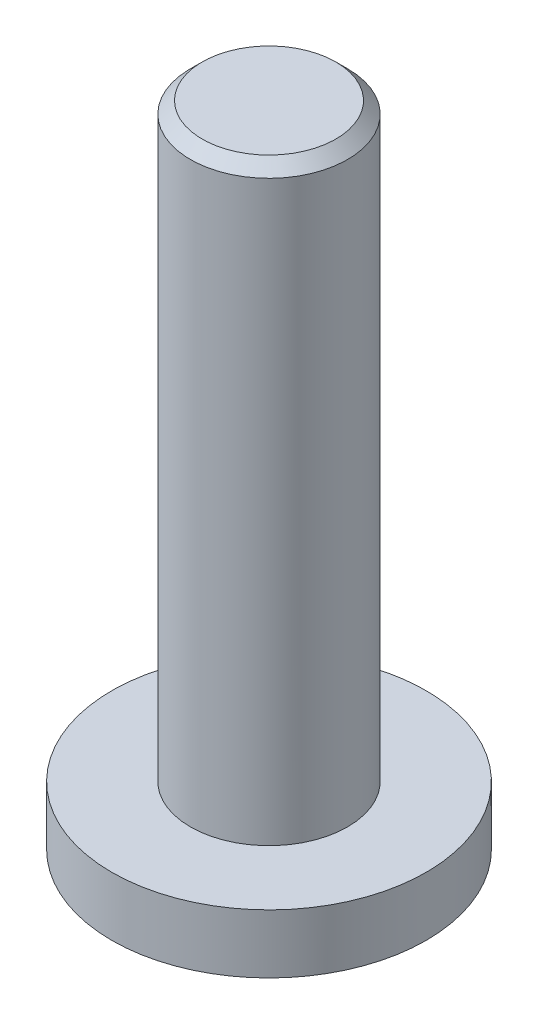
ISO-10303-21;
HEADER;
FILE_DESCRIPTION(('STEP AP214'),'2;1');
FILE_NAME('part.step','',(''),(''),'','','');
FILE_SCHEMA(('AUTOMOTIVE_DESIGN { 1 0 10303 214 1 1 1 1 }'));
ENDSEC;
DATA;
#1=APPLICATION_CONTEXT('core data for automotive mechanical design processes');
#2=APPLICATION_PROTOCOL_DEFINITION('international standard','automotive_design',2000,#1);
#3=PRODUCT_CONTEXT('',#1,'mechanical');
#4=PRODUCT('Part','Part','',(#3));
#5=PRODUCT_RELATED_PRODUCT_CATEGORY('part','',(#4));
#6=PRODUCT_DEFINITION_FORMATION('','',#4);
#7=PRODUCT_DEFINITION_CONTEXT('part definition',#1,'design');
#8=PRODUCT_DEFINITION('design','',#6,#7);
#9=PRODUCT_DEFINITION_SHAPE('','',#8);
#10=(LENGTH_UNIT() NAMED_UNIT(*) SI_UNIT(.MILLI.,.METRE.));
#11=(NAMED_UNIT(*) PLANE_ANGLE_UNIT() SI_UNIT($,.RADIAN.));
#12=(NAMED_UNIT(*) SI_UNIT($,.STERADIAN.) SOLID_ANGLE_UNIT());
#13=UNCERTAINTY_MEASURE_WITH_UNIT(LENGTH_MEASURE(1.E-05),#10,'distance_accuracy_value','');
#14=(GEOMETRIC_REPRESENTATION_CONTEXT(3) GLOBAL_UNCERTAINTY_ASSIGNED_CONTEXT((#13)) GLOBAL_UNIT_ASSIGNED_CONTEXT((#10,
#11,#12)) REPRESENTATION_CONTEXT('',''));
#15=CARTESIAN_POINT('',(0.,0.,0.));
#16=DIRECTION('',(0.,0.,1.));
#17=DIRECTION('',(1.,0.,0.));
#18=AXIS2_PLACEMENT_3D('',#15,#16,#17);
#19=CARTESIAN_POINT('',(0.,3.,0.));
#20=DIRECTION('',(0.,-1.,0.));
#21=DIRECTION('',(0.,0.,-1.));
#22=AXIS2_PLACEMENT_3D('',#19,#20,#21);
#23=CYLINDRICAL_SURFACE('',#22,8.);
#24=CARTESIAN_POINT('',(0.,3.,0.));
#25=DIRECTION('',(0.,1.,0.));
#26=DIRECTION('',(0.,0.,1.));
#27=AXIS2_PLACEMENT_3D('',#24,#25,#26);
#28=CIRCLE('',#27,8.);
#29=CARTESIAN_POINT('',(0.,3.,8.));
#30=VERTEX_POINT('',#29);
#31=EDGE_CURVE('E86',#30,#30,#28,.T.);
#32=ORIENTED_EDGE('',*,*,#31,.F.);
#33=EDGE_LOOP('',(#32));
#34=FACE_BOUND('',#33,.T.);
#35=CARTESIAN_POINT('',(0.,0.,0.));
#36=DIRECTION('',(0.,1.,0.));
#37=DIRECTION('',(0.,0.,1.));
#38=AXIS2_PLACEMENT_3D('',#35,#36,#37);
#39=CIRCLE('',#38,8.);
#40=CARTESIAN_POINT('',(0.,0.,8.));
#41=VERTEX_POINT('',#40);
#42=EDGE_CURVE('E90',#41,#41,#39,.T.);
#43=ORIENTED_EDGE('',*,*,#42,.T.);
#44=EDGE_LOOP('',(#43));
#45=FACE_BOUND('',#44,.T.);
#46=ADVANCED_FACE('F41',(#34,#45),#23,.T.);
#47=CARTESIAN_POINT('',(0.,3.,0.));
#48=DIRECTION('',(0.,1.,0.));
#49=DIRECTION('',(0.,0.,1.));
#50=AXIS2_PLACEMENT_3D('',#47,#48,#49);
#51=PLANE('',#50);
#52=CARTESIAN_POINT('',(0.,3.,0.));
#53=DIRECTION('',(0.,1.,0.));
#54=DIRECTION('',(0.,0.,1.));
#55=AXIS2_PLACEMENT_3D('',#52,#53,#54);
#56=CIRCLE('',#55,4.);
#57=CARTESIAN_POINT('',(0.,3.,4.));
#58=VERTEX_POINT('',#57);
#59=EDGE_CURVE('E85',#58,#58,#56,.T.);
#60=ORIENTED_EDGE('',*,*,#59,.F.);
#61=EDGE_LOOP('',(#60));
#62=FACE_BOUND('',#61,.T.);
#63=ORIENTED_EDGE('',*,*,#31,.T.);
#64=EDGE_LOOP('',(#63));
#65=FACE_BOUND('',#64,.T.);
#66=ADVANCED_FACE('F69',(#62,#65),#51,.T.);
#67=CARTESIAN_POINT('',(0.,33.,0.));
#68=DIRECTION('',(0.,-1.,0.));
#69=DIRECTION('',(0.,0.,-1.));
#70=AXIS2_PLACEMENT_3D('',#67,#68,#69);
#71=CYLINDRICAL_SURFACE('',#70,4.);
#72=CARTESIAN_POINT('',(0.,32.4,0.));
#73=DIRECTION('',(0.,1.,0.));
#74=DIRECTION('',(0.,0.,1.));
#75=AXIS2_PLACEMENT_3D('',#72,#73,#74);
#76=CIRCLE('',#75,4.);
#77=CARTESIAN_POINT('',(0.,32.4,-4.));
#78=VERTEX_POINT('',#77);
#79=EDGE_CURVE('E11',#78,#78,#76,.F.);
#80=ORIENTED_EDGE('',*,*,#79,.T.);
#81=EDGE_LOOP('',(#80));
#82=FACE_BOUND('',#81,.T.);
#83=ORIENTED_EDGE('',*,*,#59,.T.);
#84=EDGE_LOOP('',(#83));
#85=FACE_BOUND('',#84,.T.);
#86=ADVANCED_FACE('F64',(#82,#85),#71,.T.);
#87=CARTESIAN_POINT('',(0.,33.,0.));
#88=DIRECTION('',(0.,1.,0.));
#89=DIRECTION('',(0.,0.,1.));
#90=AXIS2_PLACEMENT_3D('',#87,#88,#89);
#91=PLANE('',#90);
#92=CARTESIAN_POINT('',(0.,33.,0.));
#93=DIRECTION('',(0.,1.,0.));
#94=DIRECTION('',(0.,0.,1.));
#95=AXIS2_PLACEMENT_3D('',#92,#93,#94);
#96=CIRCLE('',#95,3.4);
#97=CARTESIAN_POINT('',(0.,33.,-3.4));
#98=VERTEX_POINT('',#97);
#99=EDGE_CURVE('E49',#98,#98,#96,.T.);
#100=ORIENTED_EDGE('',*,*,#99,.T.);
#101=EDGE_LOOP('',(#100));
#102=FACE_BOUND('',#101,.T.);
#103=ADVANCED_FACE('F54',(#102),#91,.T.);
#104=CARTESIAN_POINT('',(0.,2.14359353944893,0.));
#105=DIRECTION('',(0.,-1.,0.));
#106=DIRECTION('',(0.,0.,-1.));
#107=AXIS2_PLACEMENT_3D('',#104,#105,#106);
#108=CONICAL_SURFACE('',#107,0.,1.30899693899575);
#109=ORIENTED_EDGE('',*,*,#42,.F.);
#110=EDGE_LOOP('',(#109));
#111=FACE_BOUND('',#110,.T.);
#112=CARTESIAN_POINT('',(0.,2.14359353944893,0.));
#113=VERTEX_POINT('',#112);
#114=VERTEX_LOOP('',#113);
#115=FACE_BOUND('',#114,.T.);
#116=ADVANCED_FACE('F52',(#111,#115),#108,.F.);
#117=CARTESIAN_POINT('',(0.,33.,0.));
#118=DIRECTION('',(0.,-1.,0.));
#119=DIRECTION('',(0.,0.,-1.));
#120=AXIS2_PLACEMENT_3D('',#117,#118,#119);
#121=CONICAL_SURFACE('',#120,3.4,0.78539816339744);
#122=CARTESIAN_POINT('',(0.,32.4,-4.));
#123=CARTESIAN_POINT('',(0.,32.40625,-3.99375000000001));
#124=CARTESIAN_POINT('',(0.,32.4125,-3.9875));
#125=CARTESIAN_POINT('',(0.,32.425,-3.975));
#126=CARTESIAN_POINT('',(0.,32.43125,-3.96875));
#127=CARTESIAN_POINT('',(0.,32.44375,-3.95625));
#128=CARTESIAN_POINT('',(0.,32.45,-3.95));
#129=CARTESIAN_POINT('',(0.,32.4625,-3.9375));
#130=CARTESIAN_POINT('',(0.,32.46875,-3.93125));
#131=CARTESIAN_POINT('',(0.,32.48125,-3.91875));
#132=CARTESIAN_POINT('',(0.,32.4875,-3.9125));
#133=CARTESIAN_POINT('',(0.,32.5,-3.9));
#134=CARTESIAN_POINT('',(0.,32.50625,-3.89375));
#135=CARTESIAN_POINT('',(0.,32.51875,-3.88125));
#136=CARTESIAN_POINT('',(0.,32.525,-3.875));
#137=CARTESIAN_POINT('',(0.,32.5375,-3.8625));
#138=CARTESIAN_POINT('',(0.,32.54375,-3.85625));
#139=CARTESIAN_POINT('',(0.,32.55625,-3.84375));
#140=CARTESIAN_POINT('',(0.,32.5625,-3.8375));
#141=CARTESIAN_POINT('',(0.,32.575,-3.825));
#142=CARTESIAN_POINT('',(0.,32.58125,-3.81875));
#143=CARTESIAN_POINT('',(0.,32.59375,-3.80625));
#144=CARTESIAN_POINT('',(0.,32.6,-3.8));
#145=CARTESIAN_POINT('',(0.,32.6125,-3.7875));
#146=CARTESIAN_POINT('',(0.,32.61875,-3.78125));
#147=CARTESIAN_POINT('',(0.,32.63125,-3.76875));
#148=CARTESIAN_POINT('',(0.,32.6375,-3.7625));
#149=CARTESIAN_POINT('',(0.,32.65,-3.75));
#150=CARTESIAN_POINT('',(0.,32.65625,-3.74375));
#151=CARTESIAN_POINT('',(0.,32.66875,-3.73125));
#152=CARTESIAN_POINT('',(0.,32.675,-3.725));
#153=CARTESIAN_POINT('',(0.,32.6875,-3.7125));
#154=CARTESIAN_POINT('',(0.,32.69375,-3.70625));
#155=CARTESIAN_POINT('',(0.,32.70625,-3.69375));
#156=CARTESIAN_POINT('',(0.,32.7125,-3.6875));
#157=CARTESIAN_POINT('',(0.,32.725,-3.675));
#158=CARTESIAN_POINT('',(0.,32.73125,-3.66875));
#159=CARTESIAN_POINT('',(0.,32.74375,-3.65625));
#160=CARTESIAN_POINT('',(0.,32.75,-3.65));
#161=CARTESIAN_POINT('',(0.,32.7625,-3.6375));
#162=CARTESIAN_POINT('',(0.,32.76875,-3.63125));
#163=CARTESIAN_POINT('',(0.,32.78125,-3.61875));
#164=CARTESIAN_POINT('',(0.,32.7875,-3.6125));
#165=CARTESIAN_POINT('',(0.,32.8,-3.6));
#166=CARTESIAN_POINT('',(0.,32.80625,-3.59375));
#167=CARTESIAN_POINT('',(0.,32.81875,-3.58125));
#168=CARTESIAN_POINT('',(0.,32.825,-3.575));
#169=CARTESIAN_POINT('',(0.,32.8375,-3.5625));
#170=CARTESIAN_POINT('',(0.,32.84375,-3.55625));
#171=CARTESIAN_POINT('',(0.,32.85625,-3.54375));
#172=CARTESIAN_POINT('',(0.,32.8625,-3.5375));
#173=CARTESIAN_POINT('',(0.,32.875,-3.525));
#174=CARTESIAN_POINT('',(0.,32.88125,-3.51875));
#175=CARTESIAN_POINT('',(0.,32.89375,-3.50625));
#176=CARTESIAN_POINT('',(0.,32.9,-3.5));
#177=CARTESIAN_POINT('',(0.,32.9125,-3.4875));
#178=CARTESIAN_POINT('',(0.,32.91875,-3.48125));
#179=CARTESIAN_POINT('',(0.,32.93125,-3.46875));
#180=CARTESIAN_POINT('',(0.,32.9375,-3.4625));
#181=CARTESIAN_POINT('',(0.,32.95,-3.45));
#182=CARTESIAN_POINT('',(0.,32.95625,-3.44375));
#183=CARTESIAN_POINT('',(0.,32.96875,-3.43125));
#184=CARTESIAN_POINT('',(0.,32.975,-3.425));
#185=CARTESIAN_POINT('',(0.,32.9875,-3.4125));
#186=CARTESIAN_POINT('',(0.,32.99375,-3.40625));
#187=CARTESIAN_POINT('',(0.,33.,-3.4));
#188=B_SPLINE_CURVE_WITH_KNOTS('',3,(#122,#123,#124,#125,#126,#127,#128,#129,#130,#131,#132,
#133,#134,#135,#136,#137,#138,#139,#140,#141,#142,#143,#144,#145,#146,#147,#148,#149,#150,#151,
#152,#153,#154,#155,#156,#157,#158,#159,#160,#161,#162,#163,#164,#165,#166,#167,#168,#169,#170,
#171,#172,#173,#174,#175,#176,#177,#178,#179,#180,#181,#182,#183,#184,#185,#186,#187),
.UNSPECIFIED.,.F.,.F.,(4,2,2,2,2,2,2,2,2,2,2,2,2,2,2,2,2,2,2,2,2,2,2,2,2,2,2,2,2,2,2,2,4),(0.,
0.0265165042944938,0.0530330085889883,0.079549512883487,0.106066017177981,0.132582521472475,
0.159099025766974,0.185615530061468,0.212132034355962,0.238648538650461,0.265165042944956,
0.291681547239449,0.318198051533948,0.344714555828443,0.371231060122937,0.397747564417436,
0.42426406871193,0.450780573006424,0.477297077300923,0.503813581595417,0.530330085889911,
0.55684659018441,0.583363094478904,0.609879598773398,0.636396103067897,0.662912607362391,
0.689429111656885,0.715945615951384,0.742462120245878,0.768978624540372,0.795495128834871,
0.822011633129365,0.848528137423864),.UNSPECIFIED.);
#189=EDGE_CURVE('BSEAM44',#78,#98,#188,.T.);
#190=ORIENTED_EDGE('',*,*,#79,.F.);
#191=ORIENTED_EDGE('',*,*,#99,.F.);
#192=ORIENTED_EDGE('',*,*,#189,.T.);
#193=ORIENTED_EDGE('',*,*,#189,.F.);
#194=EDGE_LOOP('',(#190,#192,#191,#193));
#195=FACE_BOUND('',#194,.T.);
#196=ADVANCED_FACE('F44',(#195),#121,.T.);
#197=CLOSED_SHELL('',(#46,#66,#86,#103,#116,#196));
#198=MANIFOLD_SOLID_BREP('B2',#197);
#199=ADVANCED_BREP_SHAPE_REPRESENTATION('',(#18,#198),#14);
#200=SHAPE_DEFINITION_REPRESENTATION(#9,#199);
ENDSEC;
END-ISO-10303-21;
